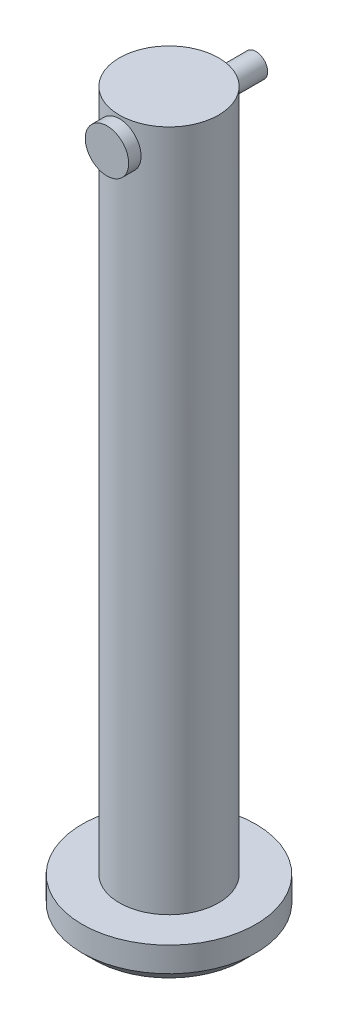
ISO-10303-21;
HEADER;
FILE_DESCRIPTION(('STEP AP214'),'2;1');
FILE_NAME('part.step','',(''),(''),'','','');
FILE_SCHEMA(('AUTOMOTIVE_DESIGN { 1 0 10303 214 1 1 1 1 }'));
ENDSEC;
DATA;
#1=APPLICATION_CONTEXT('core data for automotive mechanical design processes');
#2=APPLICATION_PROTOCOL_DEFINITION('international standard','automotive_design',2000,#1);
#3=PRODUCT_CONTEXT('',#1,'mechanical');
#4=PRODUCT('Part','Part','',(#3));
#5=PRODUCT_RELATED_PRODUCT_CATEGORY('part','',(#4));
#6=PRODUCT_DEFINITION_FORMATION('','',#4);
#7=PRODUCT_DEFINITION_CONTEXT('part definition',#1,'design');
#8=PRODUCT_DEFINITION('design','',#6,#7);
#9=PRODUCT_DEFINITION_SHAPE('','',#8);
#10=(LENGTH_UNIT() NAMED_UNIT(*) SI_UNIT(.MILLI.,.METRE.));
#11=(NAMED_UNIT(*) PLANE_ANGLE_UNIT() SI_UNIT($,.RADIAN.));
#12=(NAMED_UNIT(*) SI_UNIT($,.STERADIAN.) SOLID_ANGLE_UNIT());
#13=UNCERTAINTY_MEASURE_WITH_UNIT(LENGTH_MEASURE(1.E-05),#10,'distance_accuracy_value','');
#14=(GEOMETRIC_REPRESENTATION_CONTEXT(3) GLOBAL_UNCERTAINTY_ASSIGNED_CONTEXT((#13)) GLOBAL_UNIT_ASSIGNED_CONTEXT((#10,
#11,#12)) REPRESENTATION_CONTEXT('',''));
#15=CARTESIAN_POINT('',(0.,0.,0.));
#16=DIRECTION('',(0.,0.,1.));
#17=DIRECTION('',(1.,0.,0.));
#18=AXIS2_PLACEMENT_3D('',#15,#16,#17);
#19=CARTESIAN_POINT('',(0.,53.,-7.));
#20=DIRECTION('',(0.,0.,1.));
#21=DIRECTION('',(1.,0.,0.));
#22=AXIS2_PLACEMENT_3D('',#19,#20,#21);
#23=CYLINDRICAL_SURFACE('',#22,0.95);
#24=CARTESIAN_POINT('',(0.,53.,-7.));
#25=DIRECTION('',(0.,0.,1.));
#26=DIRECTION('',(1.,0.,0.));
#27=AXIS2_PLACEMENT_3D('',#24,#25,#26);
#28=CIRCLE('',#27,0.95);
#29=CARTESIAN_POINT('',(0.95,53.,-7.));
#30=VERTEX_POINT('',#29);
#31=EDGE_CURVE('E11',#30,#30,#28,.T.);
#32=ORIENTED_EDGE('',*,*,#31,.T.);
#33=EDGE_LOOP('',(#32));
#34=FACE_BOUND('',#33,.T.);
#35=CARTESIAN_POINT('',(0.,53.,4.));
#36=DIRECTION('',(0.,0.,1.));
#37=DIRECTION('',(1.,0.,0.));
#38=AXIS2_PLACEMENT_3D('',#35,#36,#37);
#39=CIRCLE('',#38,0.95);
#40=CARTESIAN_POINT('',(0.95,53.,4.));
#41=VERTEX_POINT('',#40);
#42=EDGE_CURVE('E41',#41,#41,#39,.F.);
#43=ORIENTED_EDGE('',*,*,#42,.T.);
#44=EDGE_LOOP('',(#43));
#45=FACE_BOUND('',#44,.T.);
#46=ADVANCED_FACE('F38',(#34,#45),#23,.T.);
#47=CARTESIAN_POINT('',(0.,53.,-7.));
#48=DIRECTION('',(0.,0.,1.));
#49=DIRECTION('',(1.,0.,0.));
#50=AXIS2_PLACEMENT_3D('',#47,#48,#49);
#51=PLANE('',#50);
#52=ORIENTED_EDGE('',*,*,#31,.F.);
#53=EDGE_LOOP('',(#52));
#54=FACE_BOUND('',#53,.T.);
#55=ADVANCED_FACE('F70',(#54),#51,.F.);
#56=CARTESIAN_POINT('',(0.,53.,4.));
#57=DIRECTION('',(0.,0.,1.));
#58=DIRECTION('',(1.,0.,0.));
#59=AXIS2_PLACEMENT_3D('',#56,#57,#58);
#60=CYLINDRICAL_SURFACE('',#59,1.75);
#61=CARTESIAN_POINT('',(0.,53.,4.));
#62=DIRECTION('',(0.,0.,1.));
#63=DIRECTION('',(1.,0.,0.));
#64=AXIS2_PLACEMENT_3D('',#61,#62,#63);
#65=CIRCLE('',#64,1.75);
#66=CARTESIAN_POINT('',(1.75,53.,4.));
#67=VERTEX_POINT('',#66);
#68=EDGE_CURVE('E48',#67,#67,#65,.T.);
#69=ORIENTED_EDGE('',*,*,#68,.T.);
#70=EDGE_LOOP('',(#69));
#71=FACE_BOUND('',#70,.T.);
#72=CARTESIAN_POINT('',(0.,53.,5.));
#73=DIRECTION('',(0.,0.,1.));
#74=DIRECTION('',(1.,0.,0.));
#75=AXIS2_PLACEMENT_3D('',#72,#73,#74);
#76=CIRCLE('',#75,1.75);
#77=CARTESIAN_POINT('',(1.75,53.,5.));
#78=VERTEX_POINT('',#77);
#79=EDGE_CURVE('E50',#78,#78,#76,.T.);
#80=ORIENTED_EDGE('',*,*,#79,.F.);
#81=EDGE_LOOP('',(#80));
#82=FACE_BOUND('',#81,.T.);
#83=ADVANCED_FACE('F56',(#71,#82),#60,.T.);
#84=CARTESIAN_POINT('',(0.,53.,4.));
#85=DIRECTION('',(0.,0.,1.));
#86=DIRECTION('',(1.,0.,0.));
#87=AXIS2_PLACEMENT_3D('',#84,#85,#86);
#88=PLANE('',#87);
#89=ORIENTED_EDGE('',*,*,#42,.F.);
#90=EDGE_LOOP('',(#89));
#91=FACE_BOUND('',#90,.T.);
#92=ORIENTED_EDGE('',*,*,#68,.F.);
#93=EDGE_LOOP('',(#92));
#94=FACE_BOUND('',#93,.T.);
#95=ADVANCED_FACE('F59',(#91,#94),#88,.F.);
#96=CARTESIAN_POINT('',(0.,53.,5.));
#97=DIRECTION('',(0.,0.,1.));
#98=DIRECTION('',(1.,0.,0.));
#99=AXIS2_PLACEMENT_3D('',#96,#97,#98);
#100=PLANE('',#99);
#101=ORIENTED_EDGE('',*,*,#79,.T.);
#102=EDGE_LOOP('',(#101));
#103=FACE_BOUND('',#102,.T.);
#104=ADVANCED_FACE('F61',(#103),#100,.T.);
#105=CLOSED_SHELL('',(#46,#55,#83,#95,#104));
#106=MANIFOLD_SOLID_BREP('B2',#105);
#107=CARTESIAN_POINT('',(0.,55.,0.));
#108=DIRECTION('',(0.,-1.,0.));
#109=DIRECTION('',(0.,0.,-1.));
#110=AXIS2_PLACEMENT_3D('',#107,#108,#109);
#111=CYLINDRICAL_SURFACE('',#110,4.);
#112=CARTESIAN_POINT('',(0.,55.,0.));
#113=DIRECTION('',(0.,1.,0.));
#114=DIRECTION('',(0.,0.,1.));
#115=AXIS2_PLACEMENT_3D('',#112,#113,#114);
#116=CIRCLE('',#115,4.);
#117=CARTESIAN_POINT('',(0.,55.,4.));
#118=VERTEX_POINT('',#117);
#119=EDGE_CURVE('E128',#118,#118,#116,.T.);
#120=ORIENTED_EDGE('',*,*,#119,.F.);
#121=EDGE_LOOP('',(#120));
#122=FACE_BOUND('',#121,.T.);
#123=CARTESIAN_POINT('',(0.,0.,0.));
#124=DIRECTION('',(0.,-1.,0.));
#125=DIRECTION('',(0.,0.,-1.));
#126=AXIS2_PLACEMENT_3D('',#123,#124,#125);
#127=CIRCLE('',#126,4.);
#128=CARTESIAN_POINT('',(0.,0.,-4.));
#129=VERTEX_POINT('',#128);
#130=EDGE_CURVE('E163',#129,#129,#127,.T.);
#131=ORIENTED_EDGE('',*,*,#130,.F.);
#132=EDGE_LOOP('',(#131));
#133=FACE_BOUND('',#132,.T.);
#134=CARTESIAN_POINT('',(-1.,53.,3.87298334620742));
#135=CARTESIAN_POINT('',(-0.9999984314387,52.9447796996432,3.87298440057185));
#136=CARTESIAN_POINT('',(-0.99541049820807,52.8895420405686,3.87417722499278));
#137=CARTESIAN_POINT('',(-0.977209250194447,52.7806529687674,3.87880744892249));
#138=CARTESIAN_POINT('',(-0.963590682698079,52.72700249822,3.8822461547418));
#139=CARTESIAN_POINT('',(-0.927796479849636,52.6228785847122,3.89095489813012));
#140=CARTESIAN_POINT('',(-0.905631891140943,52.5724011378422,3.8962225706936));
#141=CARTESIAN_POINT('',(-0.853408456505406,52.4758756589875,3.90799276818327));
#142=CARTESIAN_POINT('',(-0.823349275424505,52.4298278151688,3.91449534553241));
#143=CARTESIAN_POINT('',(-0.755483370924518,52.3424553418942,3.92816286540368));
#144=CARTESIAN_POINT('',(-0.717534755081557,52.3012425598597,3.93533839048709));
#145=CARTESIAN_POINT('',(-0.635272825640328,52.2256954422561,3.94945150206622));
#146=CARTESIAN_POINT('',(-0.590958917672139,52.1913617497514,3.95638906626691));
#147=CARTESIAN_POINT('',(-0.496458080431566,52.1300898129474,3.96936166208095));
#148=CARTESIAN_POINT('',(-0.446197830478046,52.1032614447354,3.975382749602));
#149=CARTESIAN_POINT('',(-0.341705273717113,52.0584761423388,3.9857232477043));
#150=CARTESIAN_POINT('',(-0.28747355431678,52.0405178992338,3.99004290933747));
#151=CARTESIAN_POINT('',(-0.177743503501666,52.0143408661686,3.99641903539262));
#152=CARTESIAN_POINT('',(-0.122293087819593,52.0059321422694,3.99851957537723));
#153=CARTESIAN_POINT('',(-0.0107315277051121,51.9984966482898,4.00037437642922));
#154=CARTESIAN_POINT('',(0.0453795178152232,51.9994684911162,4.00012898438682));
#155=CARTESIAN_POINT('',(0.155352247172384,52.0106299401001,3.99735237981413));
#156=CARTESIAN_POINT('',(0.209236215601064,52.0206145300215,3.99487200936349));
#157=CARTESIAN_POINT('',(0.314538247413684,52.0491885080194,3.98796334609942));
#158=CARTESIAN_POINT('',(0.365956179370436,52.067778354151,3.98353494959376));
#159=CARTESIAN_POINT('',(0.465406703501804,52.1132010282748,3.97315003880358));
#160=CARTESIAN_POINT('',(0.513404509766502,52.1401068178647,3.96718007878021));
#161=CARTESIAN_POINT('',(0.604275622340486,52.2013422716465,3.9543596152386));
#162=CARTESIAN_POINT('',(0.647148035085502,52.2356732274242,3.94750895860996));
#163=CARTESIAN_POINT('',(0.727774035084953,52.3118834967929,3.93345485507808));
#164=CARTESIAN_POINT('',(0.765357679075196,52.3539419569391,3.92624687810367));
#165=CARTESIAN_POINT('',(0.832976375963017,52.4438399894161,3.91246017406683));
#166=CARTESIAN_POINT('',(0.863011076046016,52.4916798317964,3.90588147642388));
#167=CARTESIAN_POINT('',(0.914788129022599,52.5921160136596,3.89408198732659));
#168=CARTESIAN_POINT('',(0.936489566970492,52.6447342921253,3.88886793490288));
#169=CARTESIAN_POINT('',(0.970685620636342,52.7530341872306,3.88047456055983));
#170=CARTESIAN_POINT('',(0.983182206552911,52.8087151455933,3.87729480324087));
#171=CARTESIAN_POINT('',(0.998331855466071,52.9199838006093,3.87342142415656));
#172=CARTESIAN_POINT('',(1.00123618956785,52.9755351173319,3.87266435637459));
#173=CARTESIAN_POINT('',(0.99780679620622,53.0863287746313,3.87354937392416));
#174=CARTESIAN_POINT('',(0.991473919139521,53.1415711431805,3.87519123840506));
#175=CARTESIAN_POINT('',(0.969970185575066,53.2492457059819,3.88062832781824));
#176=CARTESIAN_POINT('',(0.9549456273127,53.3017090906283,3.8843878809375));
#177=CARTESIAN_POINT('',(0.916647232668251,53.4033725831407,3.89360287308385));
#178=CARTESIAN_POINT('',(0.89337241908502,53.4525723036221,3.89905851299445));
#179=CARTESIAN_POINT('',(0.838708267174625,53.5473765111469,3.91118454837305));
#180=CARTESIAN_POINT('',(0.807168701534254,53.5928915360172,3.91787667442657));
#181=CARTESIAN_POINT('',(0.737060292934458,53.6780753451205,3.93166833228686));
#182=CARTESIAN_POINT('',(0.698490294805439,53.71774316666,3.93876793091388));
#183=CARTESIAN_POINT('',(0.614262720984725,53.7911244170284,3.95278961212642));
#184=CARTESIAN_POINT('',(0.568451952531594,53.8246640250195,3.95970280824734));
#185=CARTESIAN_POINT('',(0.47170268269468,53.8835743467805,3.97238886645493));
#186=CARTESIAN_POINT('',(0.420764448957596,53.9089454866433,3.97816178801584));
#187=CARTESIAN_POINT('',(0.315558201731095,53.9505784138112,3.98788046295326));
#188=CARTESIAN_POINT('',(0.261317381027885,53.9669057137516,3.99183932008964));
#189=CARTESIAN_POINT('',(0.15074976031881,53.9901841338434,3.99754117358315));
#190=CARTESIAN_POINT('',(0.0944233650412455,53.9971370634956,3.99928459757363));
#191=CARTESIAN_POINT('',(-0.0170835264433243,54.0013675895755,4.00034169408811));
#192=CARTESIAN_POINT('',(-0.0722538269660306,53.9989017090954,3.99971978880008));
#193=CARTESIAN_POINT('',(-0.181367496414737,53.9849521727057,3.99625896457423));
#194=CARTESIAN_POINT('',(-0.235310901780884,53.9734687849869,3.99342011157095));
#195=CARTESIAN_POINT('',(-0.340171035644813,53.9419477802291,3.98585432853963));
#196=CARTESIAN_POINT('',(-0.391102494581015,53.9219565466854,3.98113764502669));
#197=CARTESIAN_POINT('',(-0.488917053041464,53.8740294209807,3.97031288913382));
#198=CARTESIAN_POINT('',(-0.535799641265047,53.8460925273304,3.96420464137727));
#199=CARTESIAN_POINT('',(-0.625401928423897,53.7822847660029,3.95107249681342));
#200=CARTESIAN_POINT('',(-0.667994988300583,53.7462398570926,3.94403016945647));
#201=CARTESIAN_POINT('',(-0.746615020271249,53.6675771480262,3.92990649053207));
#202=CARTESIAN_POINT('',(-0.782640325068177,53.6249576839021,3.92282512952424));
#203=CARTESIAN_POINT('',(-0.84776202647924,53.5333985857987,3.90927475860683));
#204=CARTESIAN_POINT('',(-0.876716619446592,53.4843558765875,3.90281963730391));
#205=CARTESIAN_POINT('',(-0.925926896615621,53.3819445100772,3.8914395555011));
#206=CARTESIAN_POINT('',(-0.946188909759556,53.3285790338927,3.88651348244814));
#207=CARTESIAN_POINT('',(-0.974422528565572,53.2294229881737,3.87951908741315));
#208=CARTESIAN_POINT('',(-0.983993170595829,53.1841068356176,3.87708663005761));
#209=CARTESIAN_POINT('',(-0.996782292572819,53.0925311309985,3.87381838580358));
#210=CARTESIAN_POINT('',(-1.00000131437052,53.0462716597494,3.87298246270639));
#211=CARTESIAN_POINT('',(-1.,53.,3.87298334620742));
#212=B_SPLINE_CURVE_WITH_KNOTS('',3,(#134,#135,#136,#137,#138,#139,#140,#141,#142,#143,#144,
#145,#146,#147,#148,#149,#150,#151,#152,#153,#154,#155,#156,#157,#158,#159,#160,#161,#162,#163,
#164,#165,#166,#167,#168,#169,#170,#171,#172,#173,#174,#175,#176,#177,#178,#179,#180,#181,#182,
#183,#184,#185,#186,#187,#188,#189,#190,#191,#192,#193,#194,#195,#196,#197,#198,#199,#200,#201,
#202,#203,#204,#205,#206,#207,#208,#209,#210,#211),.UNSPECIFIED.,.T.,.F.,(4,2,2,2,2,2,2,2,2,2,2,
2,2,2,2,2,2,2,2,2,2,2,2,2,2,2,2,2,2,2,2,2,2,2,2,2,2,2,4),(0.,0.165490976675223,
0.331078296534208,0.496452290829153,0.66183330698466,0.830495816734648,0.99917408588221,
1.17020598555442,1.34121263935111,1.50875500394413,1.67627259462682,1.84007305071853,
2.00388222686189,2.16917149698052,2.3344895418384,2.50428186625038,2.67408212476195,
2.84470572799635,3.01529280048094,3.18137429900961,3.34744050869795,3.51078961999957,
3.67415808564842,3.84073138339937,4.00733207550293,4.17810132382402,4.34886166284095,
4.51836829119046,4.6878421955989,4.85273378447257,5.01762046947067,5.18161950620159,
5.34563922291503,5.51358838629103,5.68158012622478,5.85270590910146,6.02370688542922,
6.16239130867207,6.30106390036083),.UNSPECIFIED.);
#213=CARTESIAN_POINT('',(-1.,53.,3.87298334620742));
#214=VERTEX_POINT('',#213);
#215=EDGE_CURVE('E131',#214,#214,#212,.T.);
#216=ORIENTED_EDGE('',*,*,#215,.F.);
#217=EDGE_LOOP('',(#216));
#218=FACE_BOUND('',#217,.T.);
#219=CARTESIAN_POINT('',(0.,54.,-4.));
#220=CARTESIAN_POINT('',(0.0552507257798204,53.9999984495079,-3.99999906578675));
#221=CARTESIAN_POINT('',(0.110518771887175,53.9954056328175,-3.99884385421219));
#222=CARTESIAN_POINT('',(0.219470882513688,53.977183232462,-3.99434742553262));
#223=CARTESIAN_POINT('',(0.273154031247158,53.9635485269748,-3.99100496946646));
#224=CARTESIAN_POINT('',(0.377347248121717,53.9277071643586,-3.98250417554693));
#225=CARTESIAN_POINT('',(0.427861042286668,53.9055108008565,-3.97734801894725));
#226=CARTESIAN_POINT('',(0.524448087936283,53.8532124066368,-3.96576895871729));
#227=CARTESIAN_POINT('',(0.570521189565837,53.823110109254,-3.95934601236034));
#228=CARTESIAN_POINT('',(0.657867951533944,53.7551994735639,-3.94578275727868));
#229=CARTESIAN_POINT('',(0.699037126707379,53.7172589500272,-3.93863138099022));
#230=CARTESIAN_POINT('',(0.774499284802203,53.6350318633941,-3.92449080078353));
#231=CARTESIAN_POINT('',(0.808791491299424,53.5907445847023,-3.91750161525566));
#232=CARTESIAN_POINT('',(0.870017695199355,53.4962698488417,-3.9043651713314));
#233=CARTESIAN_POINT('',(0.896834810616904,53.4460045127931,-3.89823196313737));
#234=CARTESIAN_POINT('',(0.941597939033684,53.3415010588944,-3.88766329874815));
#235=CARTESIAN_POINT('',(0.959545370292888,53.2872635777828,-3.88322757115193));
#236=CARTESIAN_POINT('',(0.985703224536194,53.1775043345317,-3.87666984478367));
#237=CARTESIAN_POINT('',(0.994101512222226,53.1220300693001,-3.87450327383617));
#238=CARTESIAN_POINT('',(1.00150785004524,53.0104209539907,-3.8725957502516));
#239=CARTESIAN_POINT('',(1.00051742787865,52.9542862128676,-3.87285440299096));
#240=CARTESIAN_POINT('',(0.989324349759521,52.8443894615037,-3.87572803664412));
#241=CARTESIAN_POINT('',(0.979345560127013,52.7906029190233,-3.87828575334586));
#242=CARTESIAN_POINT('',(0.950816124602072,52.6854926327258,-3.88537806450989));
#243=CARTESIAN_POINT('',(0.932264868046283,52.6341690646473,-3.88991279980464));
#244=CARTESIAN_POINT('',(0.886926318624771,52.5348413224986,-3.90050075936124));
#245=CARTESIAN_POINT('',(0.860057778155276,52.4868758854736,-3.90656884979614));
#246=CARTESIAN_POINT('',(0.798904184009972,52.3960541934954,-3.91953140564257));
#247=CARTESIAN_POINT('',(0.764617832539228,52.3531988346218,-3.9264260155649));
#248=CARTESIAN_POINT('',(0.688442283120814,52.2725309228704,-3.94050587026521));
#249=CARTESIAN_POINT('',(0.646364172110576,52.2348970066258,-3.94769379651981));
#250=CARTESIAN_POINT('',(0.55640794500247,52.1671858383574,-3.96137310385857));
#251=CARTESIAN_POINT('',(0.5085296518053,52.1371088171576,-3.96786446366277));
#252=CARTESIAN_POINT('',(0.408077259120932,52.0852996091837,-3.97945154729455));
#253=CARTESIAN_POINT('',(0.355487595472419,52.0635964398304,-3.9845424008515));
#254=CARTESIAN_POINT('',(0.247250672095257,52.0293884628603,-3.99271944660946));
#255=CARTESIAN_POINT('',(0.191603999433657,52.0168818957212,-3.99580602226187));
#256=CARTESIAN_POINT('',(0.0803599802600167,52.0016949562941,-3.9995699951425));
#257=CARTESIAN_POINT('',(0.0247978133254724,51.9987713159498,-4.00030702338852));
#258=CARTESIAN_POINT('',(-0.0860219165343387,52.0021660013703,-3.999458698763));
#259=CARTESIAN_POINT('',(-0.141279506429729,52.0084834951994,-3.99787355494564));
#260=CARTESIAN_POINT('',(-0.249076179184327,52.0299806055943,-3.99259720751571));
#261=CARTESIAN_POINT('',(-0.301643412645836,52.0450275089847,-3.98893756123874));
#262=CARTESIAN_POINT('',(-0.403504861635007,52.0834047226856,-3.97992471089423));
#263=CARTESIAN_POINT('',(-0.452798746021756,52.1067358695421,-3.97457133579928));
#264=CARTESIAN_POINT('',(-0.547682089619897,52.1614907525831,-3.96262205284207));
#265=CARTESIAN_POINT('',(-0.593190294557219,52.1930507415978,-3.95600578244621));
#266=CARTESIAN_POINT('',(-0.678351075762164,52.2631932725313,-3.94229672791613));
#267=CARTESIAN_POINT('',(-0.718002639315339,52.3017770264113,-3.93520386167803));
#268=CARTESIAN_POINT('',(-0.79132704538182,52.3860013072296,-3.92112637973847));
#269=CARTESIAN_POINT('',(-0.824829245081354,52.4317918020016,-3.91414869458187));
#270=CARTESIAN_POINT('',(-0.883673839341797,52.5284884229771,-3.90128585584826));
#271=CARTESIAN_POINT('',(-0.90901659610529,52.5793943219732,-3.89540065378017));
#272=CARTESIAN_POINT('',(-0.950634280406194,52.684603814942,-3.88545396489777));
#273=CARTESIAN_POINT('',(-0.966962931102709,52.7388850855627,-3.88138170194604));
#274=CARTESIAN_POINT('',(-0.990230439969185,52.8495397585927,-3.87551162726789));
#275=CARTESIAN_POINT('',(-0.997171351652439,52.9059127006883,-3.87371331813291));
#276=CARTESIAN_POINT('',(-1.00135906022266,53.0174140159035,-3.87263267469304));
#277=CARTESIAN_POINT('',(-0.99887859852008,53.0725316234165,-3.87327955152176));
#278=CARTESIAN_POINT('',(-0.984918185541912,53.1815359257786,-3.87685272671895));
#279=CARTESIAN_POINT('',(-0.973438415124513,53.2354226453424,-3.87977897927904));
#280=CARTESIAN_POINT('',(-0.941954212961865,53.3401389727103,-3.88754173788482));
#281=CARTESIAN_POINT('',(-0.922000936453587,53.3909848701601,-3.89236676824206));
#282=CARTESIAN_POINT('',(-0.874176609070051,53.4886435884758,-3.90338503816552));
#283=CARTESIAN_POINT('',(-0.846304460022794,53.5354558487913,-3.90957846747182));
#284=CARTESIAN_POINT('',(-0.782578499091424,53.6250364193347,-3.92283756175675));
#285=CARTESIAN_POINT('',(-0.746535441941502,53.6676673822826,-3.92992176554505));
#286=CARTESIAN_POINT('',(-0.667859580793156,53.7463646965303,-3.94405351497524));
#287=CARTESIAN_POINT('',(-0.625225214174096,53.782429486742,-3.95110105151373));
#288=CARTESIAN_POINT('',(-0.533645057801726,53.8476075390431,-3.96451770431775));
#289=CARTESIAN_POINT('',(-0.484598948210924,53.8765830757811,-3.97087222243912));
#290=CARTESIAN_POINT('',(-0.382177373006984,53.9258316419604,-3.98203283316746));
#291=CARTESIAN_POINT('',(-0.32880504229116,53.946110907099,-3.98684003466521));
#292=CARTESIAN_POINT('',(-0.229606835495648,53.9743812202198,-3.99365373043694));
#293=CARTESIAN_POINT('',(-0.184253447272045,53.983967495369,-3.9960172336846));
#294=CARTESIAN_POINT('',(-0.0926040476908547,53.996777295748,-3.99919070154632));
#295=CARTESIAN_POINT('',(-0.0463081074950772,54.0000012995369,-4.00000078300596));
#296=CARTESIAN_POINT('',(0.,54.,-4.));
#297=B_SPLINE_CURVE_WITH_KNOTS('',3,(#219,#220,#221,#222,#223,#224,#225,#226,#227,#228,#229,
#230,#231,#232,#233,#234,#235,#236,#237,#238,#239,#240,#241,#242,#243,#244,#245,#246,#247,#248,
#249,#250,#251,#252,#253,#254,#255,#256,#257,#258,#259,#260,#261,#262,#263,#264,#265,#266,#267,
#268,#269,#270,#271,#272,#273,#274,#275,#276,#277,#278,#279,#280,#281,#282,#283,#284,#285,#286,
#287,#288,#289,#290,#291,#292,#293,#294,#295,#296),.UNSPECIFIED.,.T.,.F.,(4,2,2,2,2,2,2,2,2,2,2,
2,2,2,2,2,2,2,2,2,2,2,2,2,2,2,2,2,2,2,2,2,2,2,2,2,2,2,4),(0.,0.165582474981259,
0.331258825175933,0.496736601524068,0.662219960112883,0.830762902914257,0.99932486386708,
1.17039098363871,1.34142974112912,1.50904196732954,1.67662692075131,1.84014998004678,
2.00368468977359,2.16887018582586,2.33408460557442,2.50401000646013,2.67394059705498,
2.84445486006076,3.01493649125762,3.18105539299518,3.34715934075162,3.51080183009358,
3.67446084881527,3.84102391710234,4.00761575338679,4.17829672802984,4.34897012499671,
4.51861503076024,4.68822282168272,4.85295853599075,5.01769093970689,5.18144267039631,
5.34521712091267,5.51326384273274,5.68135046513612,5.85248123666392,6.02348909214233,
6.16228161961433,6.3010637069536),.UNSPECIFIED.);
#298=CARTESIAN_POINT('',(0.,54.,-4.));
#299=VERTEX_POINT('',#298);
#300=EDGE_CURVE('E115',#299,#299,#297,.T.);
#301=ORIENTED_EDGE('',*,*,#300,.F.);
#302=EDGE_LOOP('',(#301));
#303=FACE_BOUND('',#302,.T.);
#304=ADVANCED_FACE('F111',(#122,#133,#218,#303),#111,.T.);
#305=CARTESIAN_POINT('',(0.,55.,0.));
#306=DIRECTION('',(0.,1.,0.));
#307=DIRECTION('',(0.,0.,1.));
#308=AXIS2_PLACEMENT_3D('',#305,#306,#307);
#309=PLANE('',#308);
#310=ORIENTED_EDGE('',*,*,#119,.T.);
#311=EDGE_LOOP('',(#310));
#312=FACE_BOUND('',#311,.T.);
#313=ADVANCED_FACE('F154',(#312),#309,.T.);
#314=CARTESIAN_POINT('',(0.,-3.,0.));
#315=DIRECTION('',(0.,1.,0.));
#316=DIRECTION('',(0.,0.,1.));
#317=AXIS2_PLACEMENT_3D('',#314,#315,#316);
#318=CYLINDRICAL_SURFACE('',#317,7.);
#319=CARTESIAN_POINT('',(0.,-1.99999999999999,0.));
#320=DIRECTION('',(0.,-1.,0.));
#321=DIRECTION('',(0.,0.,-1.));
#322=AXIS2_PLACEMENT_3D('',#319,#320,#321);
#323=CIRCLE('',#322,7.);
#324=CARTESIAN_POINT('',(0.,-1.99999999999999,-7.));
#325=VERTEX_POINT('',#324);
#326=EDGE_CURVE('E37',#325,#325,#323,.F.);
#327=ORIENTED_EDGE('',*,*,#326,.T.);
#328=EDGE_LOOP('',(#327));
#329=FACE_BOUND('',#328,.T.);
#330=CARTESIAN_POINT('',(0.,0.,0.));
#331=DIRECTION('',(0.,-1.,0.));
#332=DIRECTION('',(0.,0.,-1.));
#333=AXIS2_PLACEMENT_3D('',#330,#331,#332);
#334=CIRCLE('',#333,7.);
#335=CARTESIAN_POINT('',(0.,0.,-7.));
#336=VERTEX_POINT('',#335);
#337=EDGE_CURVE('E165',#336,#336,#334,.T.);
#338=ORIENTED_EDGE('',*,*,#337,.T.);
#339=EDGE_LOOP('',(#338));
#340=FACE_BOUND('',#339,.T.);
#341=ADVANCED_FACE('F148',(#329,#340),#318,.T.);
#342=CARTESIAN_POINT('',(0.,-3.,0.));
#343=DIRECTION('',(0.,-1.,0.));
#344=DIRECTION('',(0.,0.,-1.));
#345=AXIS2_PLACEMENT_3D('',#342,#343,#344);
#346=PLANE('',#345);
#347=CARTESIAN_POINT('',(0.,-3.,0.));
#348=DIRECTION('',(0.,-1.,0.));
#349=DIRECTION('',(0.,0.,-1.));
#350=AXIS2_PLACEMENT_3D('',#347,#348,#349);
#351=CIRCLE('',#350,6.);
#352=CARTESIAN_POINT('',(0.,-3.,-6.));
#353=VERTEX_POINT('',#352);
#354=EDGE_CURVE('E123',#353,#353,#351,.T.);
#355=ORIENTED_EDGE('',*,*,#354,.T.);
#356=EDGE_LOOP('',(#355));
#357=FACE_BOUND('',#356,.T.);
#358=ADVANCED_FACE('F143',(#357),#346,.T.);
#359=CARTESIAN_POINT('',(0.,0.,0.));
#360=DIRECTION('',(0.,-1.,0.));
#361=DIRECTION('',(0.,0.,-1.));
#362=AXIS2_PLACEMENT_3D('',#359,#360,#361);
#363=PLANE('',#362);
#364=ORIENTED_EDGE('',*,*,#130,.T.);
#365=EDGE_LOOP('',(#364));
#366=FACE_BOUND('',#365,.T.);
#367=ORIENTED_EDGE('',*,*,#337,.F.);
#368=EDGE_LOOP('',(#367));
#369=FACE_BOUND('',#368,.T.);
#370=ADVANCED_FACE('F147',(#366,#369),#363,.F.);
#371=CARTESIAN_POINT('',(0.,-3.,0.));
#372=DIRECTION('',(0.,1.,0.));
#373=DIRECTION('',(0.,0.,1.));
#374=AXIS2_PLACEMENT_3D('',#371,#372,#373);
#375=CONICAL_SURFACE('',#374,6.,0.785398163397447);
#376=ORIENTED_EDGE('',*,*,#326,.F.);
#377=EDGE_LOOP('',(#376));
#378=FACE_BOUND('',#377,.T.);
#379=ORIENTED_EDGE('',*,*,#354,.F.);
#380=EDGE_LOOP('',(#379));
#381=FACE_BOUND('',#380,.T.);
#382=ADVANCED_FACE('F113',(#378,#381),#375,.T.);
#383=CARTESIAN_POINT('',(0.,53.,10.));
#384=DIRECTION('',(0.,0.,-1.));
#385=DIRECTION('',(-1.,0.,0.));
#386=AXIS2_PLACEMENT_3D('',#383,#384,#385);
#387=CYLINDRICAL_SURFACE('',#386,1.);
#388=ORIENTED_EDGE('',*,*,#215,.T.);
#389=EDGE_LOOP('',(#388));
#390=FACE_BOUND('',#389,.T.);
#391=ORIENTED_EDGE('',*,*,#300,.T.);
#392=EDGE_LOOP('',(#391));
#393=FACE_BOUND('',#392,.T.);
#394=ADVANCED_FACE('F138',(#390,#393),#387,.F.);
#395=CLOSED_SHELL('',(#304,#313,#341,#358,#370,#382,#394));
#396=MANIFOLD_SOLID_BREP('B6',#395);
#397=ADVANCED_BREP_SHAPE_REPRESENTATION('',(#18,#106,#396),#14);
#398=SHAPE_DEFINITION_REPRESENTATION(#9,#397);
ENDSEC;
END-ISO-10303-21;
